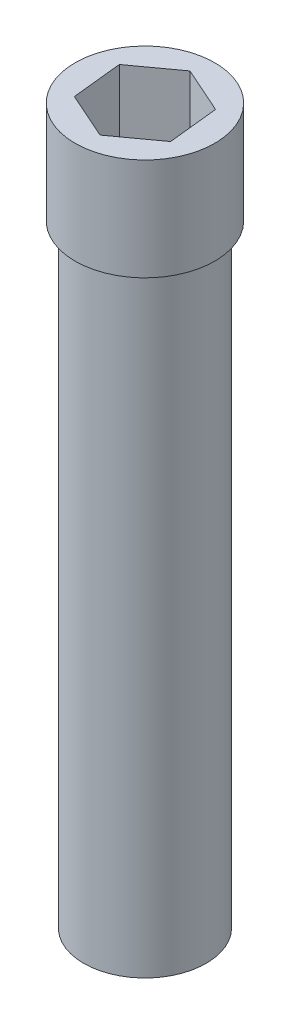
ISO-10303-21;
HEADER;
FILE_DESCRIPTION(('STEP AP214'),'2;1');
FILE_NAME('part.step','',(''),(''),'','','');
FILE_SCHEMA(('AUTOMOTIVE_DESIGN { 1 0 10303 214 1 1 1 1 }'));
ENDSEC;
DATA;
#1=APPLICATION_CONTEXT('core data for automotive mechanical design processes');
#2=APPLICATION_PROTOCOL_DEFINITION('international standard','automotive_design',2000,#1);
#3=PRODUCT_CONTEXT('',#1,'mechanical');
#4=PRODUCT('Part','Part','',(#3));
#5=PRODUCT_RELATED_PRODUCT_CATEGORY('part','',(#4));
#6=PRODUCT_DEFINITION_FORMATION('','',#4);
#7=PRODUCT_DEFINITION_CONTEXT('part definition',#1,'design');
#8=PRODUCT_DEFINITION('design','',#6,#7);
#9=PRODUCT_DEFINITION_SHAPE('','',#8);
#10=(LENGTH_UNIT() NAMED_UNIT(*) SI_UNIT(.MILLI.,.METRE.));
#11=(NAMED_UNIT(*) PLANE_ANGLE_UNIT() SI_UNIT($,.RADIAN.));
#12=(NAMED_UNIT(*) SI_UNIT($,.STERADIAN.) SOLID_ANGLE_UNIT());
#13=UNCERTAINTY_MEASURE_WITH_UNIT(LENGTH_MEASURE(1.E-05),#10,'distance_accuracy_value','');
#14=(GEOMETRIC_REPRESENTATION_CONTEXT(3) GLOBAL_UNCERTAINTY_ASSIGNED_CONTEXT((#13)) GLOBAL_UNIT_ASSIGNED_CONTEXT((#10,
#11,#12)) REPRESENTATION_CONTEXT('',''));
#15=CARTESIAN_POINT('',(0.,0.,0.));
#16=DIRECTION('',(0.,0.,1.));
#17=DIRECTION('',(1.,0.,0.));
#18=AXIS2_PLACEMENT_3D('',#15,#16,#17);
#19=CARTESIAN_POINT('',(0.,30.,0.));
#20=DIRECTION('',(0.,-1.,0.));
#21=DIRECTION('',(0.,0.,-1.));
#22=AXIS2_PLACEMENT_3D('',#19,#20,#21);
#23=CYLINDRICAL_SURFACE('',#22,3.);
#24=CARTESIAN_POINT('',(0.,30.,0.));
#25=DIRECTION('',(0.,1.,0.));
#26=DIRECTION('',(0.,0.,1.));
#27=AXIS2_PLACEMENT_3D('',#24,#25,#26);
#28=CIRCLE('',#27,3.);
#29=CARTESIAN_POINT('',(0.,30.,3.));
#30=VERTEX_POINT('',#29);
#31=EDGE_CURVE('E11',#30,#30,#28,.T.);
#32=ORIENTED_EDGE('',*,*,#31,.F.);
#33=EDGE_LOOP('',(#32));
#34=FACE_BOUND('',#33,.T.);
#35=CARTESIAN_POINT('',(0.,0.,0.));
#36=DIRECTION('',(0.,1.,0.));
#37=DIRECTION('',(0.,0.,1.));
#38=AXIS2_PLACEMENT_3D('',#35,#36,#37);
#39=CIRCLE('',#38,3.);
#40=CARTESIAN_POINT('',(0.,0.,3.));
#41=VERTEX_POINT('',#40);
#42=EDGE_CURVE('E36',#41,#41,#39,.T.);
#43=ORIENTED_EDGE('',*,*,#42,.T.);
#44=EDGE_LOOP('',(#43));
#45=FACE_BOUND('',#44,.T.);
#46=ADVANCED_FACE('F33',(#34,#45),#23,.T.);
#47=CARTESIAN_POINT('',(0.,0.,0.));
#48=DIRECTION('',(0.,1.,0.));
#49=DIRECTION('',(0.,0.,1.));
#50=AXIS2_PLACEMENT_3D('',#47,#48,#49);
#51=PLANE('',#50);
#52=ORIENTED_EDGE('',*,*,#42,.F.);
#53=EDGE_LOOP('',(#52));
#54=FACE_BOUND('',#53,.T.);
#55=ADVANCED_FACE('F164',(#54),#51,.F.);
#56=CARTESIAN_POINT('',(0.,35.,0.));
#57=DIRECTION('',(0.,-1.,0.));
#58=DIRECTION('',(0.,0.,-1.));
#59=AXIS2_PLACEMENT_3D('',#56,#57,#58);
#60=CYLINDRICAL_SURFACE('',#59,3.42046218774851);
#61=CARTESIAN_POINT('',(0.,35.,0.));
#62=DIRECTION('',(0.,1.,0.));
#63=DIRECTION('',(0.,0.,1.));
#64=AXIS2_PLACEMENT_3D('',#61,#62,#63);
#65=CIRCLE('',#64,3.42046218774851);
#66=CARTESIAN_POINT('',(0.,35.,3.42046218774851));
#67=VERTEX_POINT('',#66);
#68=EDGE_CURVE('E140',#67,#67,#65,.T.);
#69=ORIENTED_EDGE('',*,*,#68,.F.);
#70=EDGE_LOOP('',(#69));
#71=FACE_BOUND('',#70,.T.);
#72=CARTESIAN_POINT('',(0.,30.,0.));
#73=DIRECTION('',(0.,1.,0.));
#74=DIRECTION('',(0.,0.,1.));
#75=AXIS2_PLACEMENT_3D('',#72,#73,#74);
#76=CIRCLE('',#75,3.42046218774851);
#77=CARTESIAN_POINT('',(0.,30.,3.42046218774851));
#78=VERTEX_POINT('',#77);
#79=EDGE_CURVE('E134',#78,#78,#76,.T.);
#80=ORIENTED_EDGE('',*,*,#79,.T.);
#81=EDGE_LOOP('',(#80));
#82=FACE_BOUND('',#81,.T.);
#83=ADVANCED_FACE('F146',(#71,#82),#60,.T.);
#84=CARTESIAN_POINT('',(0.,35.,0.));
#85=DIRECTION('',(0.,1.,0.));
#86=DIRECTION('',(0.,0.,1.));
#87=AXIS2_PLACEMENT_3D('',#84,#85,#86);
#88=PLANE('',#87);
#89=DIRECTION('',(-0.913544574829607,0.,-0.406738625900459));
#90=VECTOR('',#89,1.);
#91=CARTESIAN_POINT('',(2.00298550640401,35.,-1.45524751111598));
#92=LINE('',#91,#90);
#93=CARTESIAN_POINT('',(2.00298550640401,35.,-1.45524751111598));
#94=VERTEX_POINT('',#93);
#95=CARTESIAN_POINT('',(-0.258788560218509,35.,-2.46226008751591));
#96=VERTEX_POINT('',#95);
#97=EDGE_CURVE('E47',#94,#96,#92,.T.);
#98=ORIENTED_EDGE('',*,*,#97,.F.);
#99=DIRECTION('',(-0.104526304684631,0.,-0.994522122242123));
#100=VECTOR('',#99,1.);
#101=CARTESIAN_POINT('',(2.26177406662252,35.,1.00701257639993));
#102=LINE('',#101,#100);
#103=CARTESIAN_POINT('',(2.26177406662252,35.,1.00701257639993));
#104=VERTEX_POINT('',#103);
#105=EDGE_CURVE('E130',#104,#94,#102,.T.);
#106=ORIENTED_EDGE('',*,*,#105,.F.);
#107=DIRECTION('',(0.809018270144976,0.,-0.587783496341664));
#108=VECTOR('',#107,1.);
#109=CARTESIAN_POINT('',(0.258788560218506,35.,2.46226008751591));
#110=LINE('',#109,#108);
#111=CARTESIAN_POINT('',(0.258788560218506,35.,2.46226008751591));
#112=VERTEX_POINT('',#111);
#113=EDGE_CURVE('E128',#112,#104,#110,.T.);
#114=ORIENTED_EDGE('',*,*,#113,.F.);
#115=DIRECTION('',(0.913544574829607,0.,0.406738625900458));
#116=VECTOR('',#115,1.);
#117=CARTESIAN_POINT('',(-2.00298550640401,35.,1.45524751111598));
#118=LINE('',#117,#116);
#119=CARTESIAN_POINT('',(-2.00298550640401,35.,1.45524751111598));
#120=VERTEX_POINT('',#119);
#121=EDGE_CURVE('E95',#120,#112,#118,.T.);
#122=ORIENTED_EDGE('',*,*,#121,.F.);
#123=DIRECTION('',(0.104526304684631,0.,0.994522122242123));
#124=VECTOR('',#123,1.);
#125=CARTESIAN_POINT('',(-2.26177406662252,35.,-1.00701257639992));
#126=LINE('',#125,#124);
#127=CARTESIAN_POINT('',(-2.26177406662252,35.,-1.00701257639992));
#128=VERTEX_POINT('',#127);
#129=EDGE_CURVE('E124',#128,#120,#126,.T.);
#130=ORIENTED_EDGE('',*,*,#129,.F.);
#131=DIRECTION('',(-0.809018270144976,0.,0.587783496341665));
#132=VECTOR('',#131,1.);
#133=CARTESIAN_POINT('',(-0.258788560218509,35.,-2.46226008751591));
#134=LINE('',#133,#132);
#135=EDGE_CURVE('E121',#96,#128,#134,.T.);
#136=ORIENTED_EDGE('',*,*,#135,.F.);
#137=EDGE_LOOP('',(#98,#106,#114,#122,#130,#136));
#138=FACE_BOUND('',#137,.T.);
#139=ORIENTED_EDGE('',*,*,#68,.T.);
#140=EDGE_LOOP('',(#139));
#141=FACE_BOUND('',#140,.T.);
#142=ADVANCED_FACE('F151',(#138,#141),#88,.T.);
#143=CARTESIAN_POINT('',(0.,30.,0.));
#144=DIRECTION('',(0.,1.,0.));
#145=DIRECTION('',(0.,0.,1.));
#146=AXIS2_PLACEMENT_3D('',#143,#144,#145);
#147=PLANE('',#146);
#148=ORIENTED_EDGE('',*,*,#31,.T.);
#149=EDGE_LOOP('',(#148));
#150=FACE_BOUND('',#149,.T.);
#151=ORIENTED_EDGE('',*,*,#79,.F.);
#152=EDGE_LOOP('',(#151));
#153=FACE_BOUND('',#152,.T.);
#154=ADVANCED_FACE('F148',(#150,#153),#147,.F.);
#155=CARTESIAN_POINT('',(2.00298550640401,31.,-1.45524751111598));
#156=DIRECTION('',(0.406738625900459,0.,-0.913544574829607));
#157=DIRECTION('',(-0.913544574829607,0.,-0.406738625900459));
#158=AXIS2_PLACEMENT_3D('',#155,#156,#157);
#159=PLANE('',#158);
#160=ORIENTED_EDGE('',*,*,#97,.T.);
#161=DIRECTION('',(0.,1.,0.));
#162=VECTOR('',#161,1.);
#163=CARTESIAN_POINT('',(-0.258788560218509,31.,-2.46226008751591));
#164=LINE('',#163,#162);
#165=CARTESIAN_POINT('',(-0.258788560218509,31.,-2.46226008751591));
#166=VERTEX_POINT('',#165);
#167=EDGE_CURVE('E77',#166,#96,#164,.T.);
#168=ORIENTED_EDGE('',*,*,#167,.F.);
#169=DIRECTION('',(-0.913544574829607,0.,-0.406738625900459));
#170=VECTOR('',#169,1.);
#171=CARTESIAN_POINT('',(2.00298550640401,31.,-1.45524751111598));
#172=LINE('',#171,#170);
#173=CARTESIAN_POINT('',(2.00298550640401,31.,-1.45524751111598));
#174=VERTEX_POINT('',#173);
#175=EDGE_CURVE('E132',#174,#166,#172,.T.);
#176=ORIENTED_EDGE('',*,*,#175,.F.);
#177=DIRECTION('',(0.,1.,0.));
#178=VECTOR('',#177,1.);
#179=CARTESIAN_POINT('',(2.00298550640401,31.,-1.45524751111598));
#180=LINE('',#179,#178);
#181=EDGE_CURVE('E55',#174,#94,#180,.T.);
#182=ORIENTED_EDGE('',*,*,#181,.T.);
#183=EDGE_LOOP('',(#160,#168,#176,#182));
#184=FACE_BOUND('',#183,.T.);
#185=ADVANCED_FACE('F150',(#184),#159,.F.);
#186=CARTESIAN_POINT('',(2.26177406662252,31.,1.00701257639993));
#187=DIRECTION('',(0.994522122242123,0.,-0.104526304684631));
#188=DIRECTION('',(-0.104526304684631,0.,-0.994522122242123));
#189=AXIS2_PLACEMENT_3D('',#186,#187,#188);
#190=PLANE('',#189);
#191=ORIENTED_EDGE('',*,*,#105,.T.);
#192=ORIENTED_EDGE('',*,*,#181,.F.);
#193=DIRECTION('',(-0.104526304684631,0.,-0.994522122242123));
#194=VECTOR('',#193,1.);
#195=CARTESIAN_POINT('',(2.26177406662252,31.,1.00701257639993));
#196=LINE('',#195,#194);
#197=CARTESIAN_POINT('',(2.26177406662252,31.,1.00701257639993));
#198=VERTEX_POINT('',#197);
#199=EDGE_CURVE('E107',#198,#174,#196,.T.);
#200=ORIENTED_EDGE('',*,*,#199,.F.);
#201=DIRECTION('',(0.,1.,0.));
#202=VECTOR('',#201,1.);
#203=CARTESIAN_POINT('',(2.26177406662252,31.,1.00701257639993));
#204=LINE('',#203,#202);
#205=EDGE_CURVE('E99',#198,#104,#204,.T.);
#206=ORIENTED_EDGE('',*,*,#205,.T.);
#207=EDGE_LOOP('',(#191,#192,#200,#206));
#208=FACE_BOUND('',#207,.T.);
#209=ADVANCED_FACE('F158',(#208),#190,.F.);
#210=CARTESIAN_POINT('',(0.258788560218506,31.,2.46226008751591));
#211=DIRECTION('',(0.587783496341664,0.,0.809018270144976));
#212=DIRECTION('',(0.809018270144976,0.,-0.587783496341664));
#213=AXIS2_PLACEMENT_3D('',#210,#211,#212);
#214=PLANE('',#213);
#215=ORIENTED_EDGE('',*,*,#113,.T.);
#216=ORIENTED_EDGE('',*,*,#205,.F.);
#217=DIRECTION('',(0.809018270144976,0.,-0.587783496341664));
#218=VECTOR('',#217,1.);
#219=CARTESIAN_POINT('',(0.258788560218506,31.,2.46226008751591));
#220=LINE('',#219,#218);
#221=CARTESIAN_POINT('',(0.258788560218506,31.,2.46226008751591));
#222=VERTEX_POINT('',#221);
#223=EDGE_CURVE('E103',#222,#198,#220,.T.);
#224=ORIENTED_EDGE('',*,*,#223,.F.);
#225=DIRECTION('',(0.,1.,0.));
#226=VECTOR('',#225,1.);
#227=CARTESIAN_POINT('',(0.258788560218506,31.,2.46226008751591));
#228=LINE('',#227,#226);
#229=EDGE_CURVE('E88',#222,#112,#228,.T.);
#230=ORIENTED_EDGE('',*,*,#229,.T.);
#231=EDGE_LOOP('',(#215,#216,#224,#230));
#232=FACE_BOUND('',#231,.T.);
#233=ADVANCED_FACE('F104',(#232),#214,.F.);
#234=CARTESIAN_POINT('',(-2.00298550640401,31.,1.45524751111598));
#235=DIRECTION('',(-0.406738625900459,0.,0.913544574829607));
#236=DIRECTION('',(0.913544574829607,0.,0.406738625900459));
#237=AXIS2_PLACEMENT_3D('',#234,#235,#236);
#238=PLANE('',#237);
#239=ORIENTED_EDGE('',*,*,#121,.T.);
#240=ORIENTED_EDGE('',*,*,#229,.F.);
#241=DIRECTION('',(0.913544574829607,0.,0.406738625900458));
#242=VECTOR('',#241,1.);
#243=CARTESIAN_POINT('',(-2.00298550640401,31.,1.45524751111598));
#244=LINE('',#243,#242);
#245=CARTESIAN_POINT('',(-2.00298550640401,31.,1.45524751111598));
#246=VERTEX_POINT('',#245);
#247=EDGE_CURVE('E92',#246,#222,#244,.T.);
#248=ORIENTED_EDGE('',*,*,#247,.F.);
#249=DIRECTION('',(0.,1.,0.));
#250=VECTOR('',#249,1.);
#251=CARTESIAN_POINT('',(-2.00298550640401,31.,1.45524751111598));
#252=LINE('',#251,#250);
#253=EDGE_CURVE('E100',#246,#120,#252,.T.);
#254=ORIENTED_EDGE('',*,*,#253,.T.);
#255=EDGE_LOOP('',(#239,#240,#248,#254));
#256=FACE_BOUND('',#255,.T.);
#257=ADVANCED_FACE('F90',(#256),#238,.F.);
#258=CARTESIAN_POINT('',(-2.26177406662252,31.,-1.00701257639992));
#259=DIRECTION('',(-0.994522122242123,0.,0.104526304684631));
#260=DIRECTION('',(0.104526304684631,0.,0.994522122242123));
#261=AXIS2_PLACEMENT_3D('',#258,#259,#260);
#262=PLANE('',#261);
#263=ORIENTED_EDGE('',*,*,#129,.T.);
#264=ORIENTED_EDGE('',*,*,#253,.F.);
#265=DIRECTION('',(0.104526304684631,0.,0.994522122242123));
#266=VECTOR('',#265,1.);
#267=CARTESIAN_POINT('',(-2.26177406662252,31.,-1.00701257639992));
#268=LINE('',#267,#266);
#269=CARTESIAN_POINT('',(-2.26177406662252,31.,-1.00701257639992));
#270=VERTEX_POINT('',#269);
#271=EDGE_CURVE('E113',#270,#246,#268,.T.);
#272=ORIENTED_EDGE('',*,*,#271,.F.);
#273=DIRECTION('',(0.,1.,0.));
#274=VECTOR('',#273,1.);
#275=CARTESIAN_POINT('',(-2.26177406662252,31.,-1.00701257639992));
#276=LINE('',#275,#274);
#277=EDGE_CURVE('E137',#270,#128,#276,.T.);
#278=ORIENTED_EDGE('',*,*,#277,.T.);
#279=EDGE_LOOP('',(#263,#264,#272,#278));
#280=FACE_BOUND('',#279,.T.);
#281=ADVANCED_FACE('F219',(#280),#262,.F.);
#282=CARTESIAN_POINT('',(-0.258788560218509,31.,-2.46226008751591));
#283=DIRECTION('',(-0.587783496341665,0.,-0.809018270144976));
#284=DIRECTION('',(-0.809018270144976,0.,0.587783496341665));
#285=AXIS2_PLACEMENT_3D('',#282,#283,#284);
#286=PLANE('',#285);
#287=ORIENTED_EDGE('',*,*,#135,.T.);
#288=ORIENTED_EDGE('',*,*,#277,.F.);
#289=DIRECTION('',(-0.809018270144976,0.,0.587783496341665));
#290=VECTOR('',#289,1.);
#291=CARTESIAN_POINT('',(-0.258788560218509,31.,-2.46226008751591));
#292=LINE('',#291,#290);
#293=EDGE_CURVE('E115',#166,#270,#292,.T.);
#294=ORIENTED_EDGE('',*,*,#293,.F.);
#295=ORIENTED_EDGE('',*,*,#167,.T.);
#296=EDGE_LOOP('',(#287,#288,#294,#295));
#297=FACE_BOUND('',#296,.T.);
#298=ADVANCED_FACE('F228',(#297),#286,.F.);
#299=CARTESIAN_POINT('',(0.,31.,0.));
#300=DIRECTION('',(0.,1.,0.));
#301=DIRECTION('',(0.,0.,1.));
#302=AXIS2_PLACEMENT_3D('',#299,#300,#301);
#303=PLANE('',#302);
#304=ORIENTED_EDGE('',*,*,#175,.T.);
#305=ORIENTED_EDGE('',*,*,#293,.T.);
#306=ORIENTED_EDGE('',*,*,#271,.T.);
#307=ORIENTED_EDGE('',*,*,#247,.T.);
#308=ORIENTED_EDGE('',*,*,#223,.T.);
#309=ORIENTED_EDGE('',*,*,#199,.T.);
#310=EDGE_LOOP('',(#304,#305,#306,#307,#308,#309));
#311=FACE_BOUND('',#310,.T.);
#312=ADVANCED_FACE('F110',(#311),#303,.T.);
#313=CLOSED_SHELL('',(#46,#55,#83,#142,#154,#185,#209,#233,#257,#281,#298,#312));
#314=MANIFOLD_SOLID_BREP('B2',#313);
#315=ADVANCED_BREP_SHAPE_REPRESENTATION('',(#18,#314),#14);
#316=SHAPE_DEFINITION_REPRESENTATION(#9,#315);
ENDSEC;
END-ISO-10303-21;
